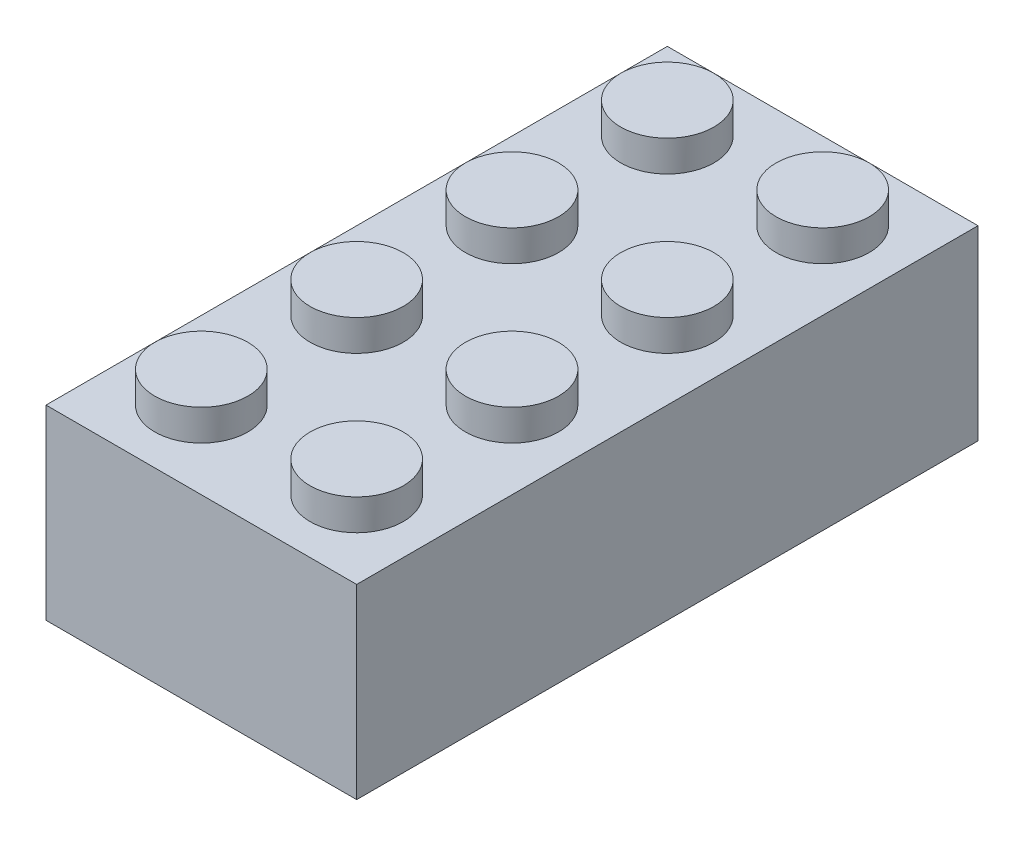
ISO-10303-21;
HEADER;
FILE_DESCRIPTION(('STEP AP214'),'2;1');
FILE_NAME('part.step','',(''),(''),'','','');
FILE_SCHEMA(('AUTOMOTIVE_DESIGN { 1 0 10303 214 1 1 1 1 }'));
ENDSEC;
DATA;
#1=APPLICATION_CONTEXT('core data for automotive mechanical design processes');
#2=APPLICATION_PROTOCOL_DEFINITION('international standard','automotive_design',2000,#1);
#3=PRODUCT_CONTEXT('',#1,'mechanical');
#4=PRODUCT('Part','Part','',(#3));
#5=PRODUCT_RELATED_PRODUCT_CATEGORY('part','',(#4));
#6=PRODUCT_DEFINITION_FORMATION('','',#4);
#7=PRODUCT_DEFINITION_CONTEXT('part definition',#1,'design');
#8=PRODUCT_DEFINITION('design','',#6,#7);
#9=PRODUCT_DEFINITION_SHAPE('','',#8);
#10=(LENGTH_UNIT() NAMED_UNIT(*) SI_UNIT(.MILLI.,.METRE.));
#11=(NAMED_UNIT(*) PLANE_ANGLE_UNIT() SI_UNIT($,.RADIAN.));
#12=(NAMED_UNIT(*) SI_UNIT($,.STERADIAN.) SOLID_ANGLE_UNIT());
#13=UNCERTAINTY_MEASURE_WITH_UNIT(LENGTH_MEASURE(1.E-05),#10,'distance_accuracy_value','');
#14=(GEOMETRIC_REPRESENTATION_CONTEXT(3) GLOBAL_UNCERTAINTY_ASSIGNED_CONTEXT((#13)) GLOBAL_UNIT_ASSIGNED_CONTEXT((#10,
#11,#12)) REPRESENTATION_CONTEXT('',''));
#15=CARTESIAN_POINT('',(0.,0.,0.));
#16=DIRECTION('',(0.,0.,1.));
#17=DIRECTION('',(1.,0.,0.));
#18=AXIS2_PLACEMENT_3D('',#15,#16,#17);
#19=CARTESIAN_POINT('',(0.,0.,0.));
#20=DIRECTION('',(0.,-1.,0.));
#21=DIRECTION('',(0.,0.,-1.));
#22=AXIS2_PLACEMENT_3D('',#19,#20,#21);
#23=PLANE('',#22);
#24=DIRECTION('',(0.,0.,1.));
#25=VECTOR('',#24,1.);
#26=CARTESIAN_POINT('',(0.,0.,0.));
#27=LINE('',#26,#25);
#28=CARTESIAN_POINT('',(0.,0.,-32.));
#29=VERTEX_POINT('',#28);
#30=CARTESIAN_POINT('',(0.,0.,0.));
#31=VERTEX_POINT('',#30);
#32=EDGE_CURVE('E224',#29,#31,#27,.T.);
#33=ORIENTED_EDGE('',*,*,#32,.F.);
#34=DIRECTION('',(-1.,0.,0.));
#35=VECTOR('',#34,1.);
#36=CARTESIAN_POINT('',(0.,0.,-32.));
#37=LINE('',#36,#35);
#38=CARTESIAN_POINT('',(16.,0.,-32.));
#39=VERTEX_POINT('',#38);
#40=EDGE_CURVE('E85',#39,#29,#37,.T.);
#41=ORIENTED_EDGE('',*,*,#40,.F.);
#42=DIRECTION('',(0.,0.,-1.));
#43=VECTOR('',#42,1.);
#44=CARTESIAN_POINT('',(16.,0.,0.));
#45=LINE('',#44,#43);
#46=CARTESIAN_POINT('',(16.,0.,0.));
#47=VERTEX_POINT('',#46);
#48=EDGE_CURVE('E242',#47,#39,#45,.T.);
#49=ORIENTED_EDGE('',*,*,#48,.F.);
#50=DIRECTION('',(1.,0.,0.));
#51=VECTOR('',#50,1.);
#52=CARTESIAN_POINT('',(0.,0.,0.));
#53=LINE('',#52,#51);
#54=EDGE_CURVE('E239',#31,#47,#53,.T.);
#55=ORIENTED_EDGE('',*,*,#54,.F.);
#56=EDGE_LOOP('',(#33,#41,#49,#55));
#57=FACE_BOUND('',#56,.T.);
#58=DIRECTION('',(-1.,0.,0.));
#59=VECTOR('',#58,1.);
#60=CARTESIAN_POINT('',(0.,0.,-30.4));
#61=LINE('',#60,#59);
#62=CARTESIAN_POINT('',(14.4,0.,-30.4));
#63=VERTEX_POINT('',#62);
#64=CARTESIAN_POINT('',(1.6,0.,-30.4));
#65=VERTEX_POINT('',#64);
#66=EDGE_CURVE('E207',#63,#65,#61,.T.);
#67=ORIENTED_EDGE('',*,*,#66,.T.);
#68=DIRECTION('',(0.,0.,1.));
#69=VECTOR('',#68,1.);
#70=CARTESIAN_POINT('',(1.6,0.,0.));
#71=LINE('',#70,#69);
#72=CARTESIAN_POINT('',(1.6,0.,-1.6));
#73=VERTEX_POINT('',#72);
#74=EDGE_CURVE('E198',#65,#73,#71,.T.);
#75=ORIENTED_EDGE('',*,*,#74,.T.);
#76=DIRECTION('',(1.,0.,0.));
#77=VECTOR('',#76,1.);
#78=CARTESIAN_POINT('',(0.,0.,-1.6));
#79=LINE('',#78,#77);
#80=CARTESIAN_POINT('',(14.4,0.,-1.6));
#81=VERTEX_POINT('',#80);
#82=EDGE_CURVE('E206',#73,#81,#79,.T.);
#83=ORIENTED_EDGE('',*,*,#82,.T.);
#84=DIRECTION('',(0.,0.,-1.));
#85=VECTOR('',#84,1.);
#86=CARTESIAN_POINT('',(14.4,0.,0.));
#87=LINE('',#86,#85);
#88=EDGE_CURVE('E55',#81,#63,#87,.T.);
#89=ORIENTED_EDGE('',*,*,#88,.T.);
#90=EDGE_LOOP('',(#67,#75,#83,#89));
#91=FACE_BOUND('',#90,.T.);
#92=ADVANCED_FACE('F39',(#57,#91),#23,.T.);
#93=CARTESIAN_POINT('',(4.,11.2,-28.));
#94=DIRECTION('',(0.,1.,0.));
#95=DIRECTION('',(0.,0.,1.));
#96=AXIS2_PLACEMENT_3D('',#93,#94,#95);
#97=PLANE('',#96);
#98=CARTESIAN_POINT('',(4.,11.2,-28.));
#99=DIRECTION('',(0.,1.,0.));
#100=DIRECTION('',(0.,0.,1.));
#101=AXIS2_PLACEMENT_3D('',#98,#99,#100);
#102=CIRCLE('',#101,2.4);
#103=CARTESIAN_POINT('',(4.,11.2,-25.6));
#104=VERTEX_POINT('',#103);
#105=EDGE_CURVE('E11',#104,#104,#102,.T.);
#106=ORIENTED_EDGE('',*,*,#105,.T.);
#107=EDGE_LOOP('',(#106));
#108=FACE_BOUND('',#107,.T.);
#109=ADVANCED_FACE('F41',(#108),#97,.T.);
#110=CARTESIAN_POINT('',(4.,11.2,-28.));
#111=DIRECTION('',(0.,-1.,0.));
#112=DIRECTION('',(0.,0.,-1.));
#113=AXIS2_PLACEMENT_3D('',#110,#111,#112);
#114=CYLINDRICAL_SURFACE('',#113,2.4);
#115=ORIENTED_EDGE('',*,*,#105,.F.);
#116=EDGE_LOOP('',(#115));
#117=FACE_BOUND('',#116,.T.);
#118=CARTESIAN_POINT('',(4.,9.6,-28.));
#119=DIRECTION('',(0.,-1.,0.));
#120=DIRECTION('',(0.,0.,-1.));
#121=AXIS2_PLACEMENT_3D('',#118,#119,#120);
#122=CIRCLE('',#121,2.4);
#123=CARTESIAN_POINT('',(4.,9.6,-30.4));
#124=VERTEX_POINT('',#123);
#125=EDGE_CURVE('E48',#124,#124,#122,.F.);
#126=ORIENTED_EDGE('',*,*,#125,.T.);
#127=EDGE_LOOP('',(#126));
#128=FACE_BOUND('',#127,.T.);
#129=ADVANCED_FACE('F310',(#117,#128),#114,.T.);
#130=CARTESIAN_POINT('',(12.,11.2,-28.));
#131=DIRECTION('',(0.,1.,0.));
#132=DIRECTION('',(0.,0.,1.));
#133=AXIS2_PLACEMENT_3D('',#130,#131,#132);
#134=PLANE('',#133);
#135=CARTESIAN_POINT('',(12.,11.2,-28.));
#136=DIRECTION('',(0.,1.,0.));
#137=DIRECTION('',(0.,0.,1.));
#138=AXIS2_PLACEMENT_3D('',#135,#136,#137);
#139=CIRCLE('',#138,2.4);
#140=CARTESIAN_POINT('',(12.,11.2,-25.6));
#141=VERTEX_POINT('',#140);
#142=EDGE_CURVE('E303',#141,#141,#139,.T.);
#143=ORIENTED_EDGE('',*,*,#142,.T.);
#144=EDGE_LOOP('',(#143));
#145=FACE_BOUND('',#144,.T.);
#146=ADVANCED_FACE('F384',(#145),#134,.T.);
#147=CARTESIAN_POINT('',(12.,11.2,-28.));
#148=DIRECTION('',(0.,-1.,0.));
#149=DIRECTION('',(0.,0.,-1.));
#150=AXIS2_PLACEMENT_3D('',#147,#148,#149);
#151=CYLINDRICAL_SURFACE('',#150,2.4);
#152=ORIENTED_EDGE('',*,*,#142,.F.);
#153=EDGE_LOOP('',(#152));
#154=FACE_BOUND('',#153,.T.);
#155=CARTESIAN_POINT('',(12.,9.6,-28.));
#156=DIRECTION('',(0.,-1.,0.));
#157=DIRECTION('',(0.,0.,-1.));
#158=AXIS2_PLACEMENT_3D('',#155,#156,#157);
#159=CIRCLE('',#158,2.4);
#160=CARTESIAN_POINT('',(12.,9.6,-30.4));
#161=VERTEX_POINT('',#160);
#162=EDGE_CURVE('E299',#161,#161,#159,.F.);
#163=ORIENTED_EDGE('',*,*,#162,.T.);
#164=EDGE_LOOP('',(#163));
#165=FACE_BOUND('',#164,.T.);
#166=ADVANCED_FACE('F380',(#154,#165),#151,.T.);
#167=CARTESIAN_POINT('',(4.,11.2,-20.));
#168=DIRECTION('',(0.,1.,0.));
#169=DIRECTION('',(0.,0.,1.));
#170=AXIS2_PLACEMENT_3D('',#167,#168,#169);
#171=PLANE('',#170);
#172=CARTESIAN_POINT('',(4.,11.2,-20.));
#173=DIRECTION('',(0.,1.,0.));
#174=DIRECTION('',(0.,0.,1.));
#175=AXIS2_PLACEMENT_3D('',#172,#173,#174);
#176=CIRCLE('',#175,2.4);
#177=CARTESIAN_POINT('',(4.,11.2,-17.6));
#178=VERTEX_POINT('',#177);
#179=EDGE_CURVE('E295',#178,#178,#176,.T.);
#180=ORIENTED_EDGE('',*,*,#179,.T.);
#181=EDGE_LOOP('',(#180));
#182=FACE_BOUND('',#181,.T.);
#183=ADVANCED_FACE('F376',(#182),#171,.T.);
#184=CARTESIAN_POINT('',(4.,11.2,-20.));
#185=DIRECTION('',(0.,-1.,0.));
#186=DIRECTION('',(0.,0.,-1.));
#187=AXIS2_PLACEMENT_3D('',#184,#185,#186);
#188=CYLINDRICAL_SURFACE('',#187,2.4);
#189=ORIENTED_EDGE('',*,*,#179,.F.);
#190=EDGE_LOOP('',(#189));
#191=FACE_BOUND('',#190,.T.);
#192=CARTESIAN_POINT('',(4.,9.6,-20.));
#193=DIRECTION('',(0.,-1.,0.));
#194=DIRECTION('',(0.,0.,-1.));
#195=AXIS2_PLACEMENT_3D('',#192,#193,#194);
#196=CIRCLE('',#195,2.4);
#197=CARTESIAN_POINT('',(4.,9.6,-22.4));
#198=VERTEX_POINT('',#197);
#199=EDGE_CURVE('E291',#198,#198,#196,.F.);
#200=ORIENTED_EDGE('',*,*,#199,.T.);
#201=EDGE_LOOP('',(#200));
#202=FACE_BOUND('',#201,.T.);
#203=ADVANCED_FACE('F372',(#191,#202),#188,.T.);
#204=CARTESIAN_POINT('',(12.,11.2,-20.));
#205=DIRECTION('',(0.,1.,0.));
#206=DIRECTION('',(0.,0.,1.));
#207=AXIS2_PLACEMENT_3D('',#204,#205,#206);
#208=PLANE('',#207);
#209=CARTESIAN_POINT('',(12.,11.2,-20.));
#210=DIRECTION('',(0.,1.,0.));
#211=DIRECTION('',(0.,0.,1.));
#212=AXIS2_PLACEMENT_3D('',#209,#210,#211);
#213=CIRCLE('',#212,2.4);
#214=CARTESIAN_POINT('',(12.,11.2,-17.6));
#215=VERTEX_POINT('',#214);
#216=EDGE_CURVE('E287',#215,#215,#213,.T.);
#217=ORIENTED_EDGE('',*,*,#216,.T.);
#218=EDGE_LOOP('',(#217));
#219=FACE_BOUND('',#218,.T.);
#220=ADVANCED_FACE('F368',(#219),#208,.T.);
#221=CARTESIAN_POINT('',(12.,11.2,-20.));
#222=DIRECTION('',(0.,-1.,0.));
#223=DIRECTION('',(0.,0.,-1.));
#224=AXIS2_PLACEMENT_3D('',#221,#222,#223);
#225=CYLINDRICAL_SURFACE('',#224,2.4);
#226=ORIENTED_EDGE('',*,*,#216,.F.);
#227=EDGE_LOOP('',(#226));
#228=FACE_BOUND('',#227,.T.);
#229=CARTESIAN_POINT('',(12.,9.6,-20.));
#230=DIRECTION('',(0.,-1.,0.));
#231=DIRECTION('',(0.,0.,-1.));
#232=AXIS2_PLACEMENT_3D('',#229,#230,#231);
#233=CIRCLE('',#232,2.4);
#234=CARTESIAN_POINT('',(12.,9.6,-22.4));
#235=VERTEX_POINT('',#234);
#236=EDGE_CURVE('E283',#235,#235,#233,.F.);
#237=ORIENTED_EDGE('',*,*,#236,.T.);
#238=EDGE_LOOP('',(#237));
#239=FACE_BOUND('',#238,.T.);
#240=ADVANCED_FACE('F364',(#228,#239),#225,.T.);
#241=CARTESIAN_POINT('',(4.,11.2,-12.));
#242=DIRECTION('',(0.,1.,0.));
#243=DIRECTION('',(0.,0.,1.));
#244=AXIS2_PLACEMENT_3D('',#241,#242,#243);
#245=PLANE('',#244);
#246=CARTESIAN_POINT('',(4.,11.2,-12.));
#247=DIRECTION('',(0.,1.,0.));
#248=DIRECTION('',(0.,0.,1.));
#249=AXIS2_PLACEMENT_3D('',#246,#247,#248);
#250=CIRCLE('',#249,2.4);
#251=CARTESIAN_POINT('',(4.,11.2,-9.6));
#252=VERTEX_POINT('',#251);
#253=EDGE_CURVE('E279',#252,#252,#250,.T.);
#254=ORIENTED_EDGE('',*,*,#253,.T.);
#255=EDGE_LOOP('',(#254));
#256=FACE_BOUND('',#255,.T.);
#257=ADVANCED_FACE('F360',(#256),#245,.T.);
#258=CARTESIAN_POINT('',(4.,11.2,-12.));
#259=DIRECTION('',(0.,-1.,0.));
#260=DIRECTION('',(0.,0.,-1.));
#261=AXIS2_PLACEMENT_3D('',#258,#259,#260);
#262=CYLINDRICAL_SURFACE('',#261,2.4);
#263=ORIENTED_EDGE('',*,*,#253,.F.);
#264=EDGE_LOOP('',(#263));
#265=FACE_BOUND('',#264,.T.);
#266=CARTESIAN_POINT('',(4.,9.6,-12.));
#267=DIRECTION('',(0.,-1.,0.));
#268=DIRECTION('',(0.,0.,-1.));
#269=AXIS2_PLACEMENT_3D('',#266,#267,#268);
#270=CIRCLE('',#269,2.4);
#271=CARTESIAN_POINT('',(4.,9.6,-14.4));
#272=VERTEX_POINT('',#271);
#273=EDGE_CURVE('E275',#272,#272,#270,.F.);
#274=ORIENTED_EDGE('',*,*,#273,.T.);
#275=EDGE_LOOP('',(#274));
#276=FACE_BOUND('',#275,.T.);
#277=ADVANCED_FACE('F356',(#265,#276),#262,.T.);
#278=CARTESIAN_POINT('',(12.,11.2,-12.));
#279=DIRECTION('',(0.,1.,0.));
#280=DIRECTION('',(0.,0.,1.));
#281=AXIS2_PLACEMENT_3D('',#278,#279,#280);
#282=PLANE('',#281);
#283=CARTESIAN_POINT('',(12.,11.2,-12.));
#284=DIRECTION('',(0.,1.,0.));
#285=DIRECTION('',(0.,0.,1.));
#286=AXIS2_PLACEMENT_3D('',#283,#284,#285);
#287=CIRCLE('',#286,2.4);
#288=CARTESIAN_POINT('',(12.,11.2,-9.6));
#289=VERTEX_POINT('',#288);
#290=EDGE_CURVE('E271',#289,#289,#287,.T.);
#291=ORIENTED_EDGE('',*,*,#290,.T.);
#292=EDGE_LOOP('',(#291));
#293=FACE_BOUND('',#292,.T.);
#294=ADVANCED_FACE('F352',(#293),#282,.T.);
#295=CARTESIAN_POINT('',(12.,11.2,-12.));
#296=DIRECTION('',(0.,-1.,0.));
#297=DIRECTION('',(0.,0.,-1.));
#298=AXIS2_PLACEMENT_3D('',#295,#296,#297);
#299=CYLINDRICAL_SURFACE('',#298,2.4);
#300=ORIENTED_EDGE('',*,*,#290,.F.);
#301=EDGE_LOOP('',(#300));
#302=FACE_BOUND('',#301,.T.);
#303=CARTESIAN_POINT('',(12.,9.6,-12.));
#304=DIRECTION('',(0.,-1.,0.));
#305=DIRECTION('',(0.,0.,-1.));
#306=AXIS2_PLACEMENT_3D('',#303,#304,#305);
#307=CIRCLE('',#306,2.4);
#308=CARTESIAN_POINT('',(12.,9.6,-14.4));
#309=VERTEX_POINT('',#308);
#310=EDGE_CURVE('E267',#309,#309,#307,.F.);
#311=ORIENTED_EDGE('',*,*,#310,.T.);
#312=EDGE_LOOP('',(#311));
#313=FACE_BOUND('',#312,.T.);
#314=ADVANCED_FACE('F348',(#302,#313),#299,.T.);
#315=CARTESIAN_POINT('',(0.,9.6,0.));
#316=DIRECTION('',(1.,0.,0.));
#317=DIRECTION('',(0.,0.,-1.));
#318=AXIS2_PLACEMENT_3D('',#315,#316,#317);
#319=PLANE('',#318);
#320=ORIENTED_EDGE('',*,*,#32,.T.);
#321=DIRECTION('',(0.,-1.,0.));
#322=VECTOR('',#321,1.);
#323=CARTESIAN_POINT('',(0.,9.6,0.));
#324=LINE('',#323,#322);
#325=CARTESIAN_POINT('',(0.,9.6,0.));
#326=VERTEX_POINT('',#325);
#327=EDGE_CURVE('E256',#326,#31,#324,.T.);
#328=ORIENTED_EDGE('',*,*,#327,.F.);
#329=DIRECTION('',(0.,0.,1.));
#330=VECTOR('',#329,1.);
#331=CARTESIAN_POINT('',(0.,9.6,0.));
#332=LINE('',#331,#330);
#333=CARTESIAN_POINT('',(0.,9.6,-32.));
#334=VERTEX_POINT('',#333);
#335=EDGE_CURVE('E225',#334,#326,#332,.T.);
#336=ORIENTED_EDGE('',*,*,#335,.F.);
#337=DIRECTION('',(0.,-1.,0.));
#338=VECTOR('',#337,1.);
#339=CARTESIAN_POINT('',(0.,9.6,-32.));
#340=LINE('',#339,#338);
#341=EDGE_CURVE('E235',#334,#29,#340,.T.);
#342=ORIENTED_EDGE('',*,*,#341,.T.);
#343=EDGE_LOOP('',(#320,#328,#336,#342));
#344=FACE_BOUND('',#343,.T.);
#345=ADVANCED_FACE('F345',(#344),#319,.F.);
#346=CARTESIAN_POINT('',(0.,9.6,0.));
#347=DIRECTION('',(0.,0.,-1.));
#348=DIRECTION('',(-1.,0.,0.));
#349=AXIS2_PLACEMENT_3D('',#346,#347,#348);
#350=PLANE('',#349);
#351=ORIENTED_EDGE('',*,*,#54,.T.);
#352=DIRECTION('',(0.,-1.,0.));
#353=VECTOR('',#352,1.);
#354=CARTESIAN_POINT('',(16.,9.6,0.));
#355=LINE('',#354,#353);
#356=CARTESIAN_POINT('',(16.,9.6,0.));
#357=VERTEX_POINT('',#356);
#358=EDGE_CURVE('E252',#357,#47,#355,.T.);
#359=ORIENTED_EDGE('',*,*,#358,.F.);
#360=DIRECTION('',(1.,0.,0.));
#361=VECTOR('',#360,1.);
#362=CARTESIAN_POINT('',(0.,9.6,0.));
#363=LINE('',#362,#361);
#364=EDGE_CURVE('E93',#326,#357,#363,.T.);
#365=ORIENTED_EDGE('',*,*,#364,.F.);
#366=ORIENTED_EDGE('',*,*,#327,.T.);
#367=EDGE_LOOP('',(#351,#359,#365,#366));
#368=FACE_BOUND('',#367,.T.);
#369=ADVANCED_FACE('F341',(#368),#350,.F.);
#370=CARTESIAN_POINT('',(16.,9.6,0.));
#371=DIRECTION('',(-1.,0.,0.));
#372=DIRECTION('',(0.,0.,1.));
#373=AXIS2_PLACEMENT_3D('',#370,#371,#372);
#374=PLANE('',#373);
#375=ORIENTED_EDGE('',*,*,#48,.T.);
#376=DIRECTION('',(0.,-1.,0.));
#377=VECTOR('',#376,1.);
#378=CARTESIAN_POINT('',(16.,9.6,-32.));
#379=LINE('',#378,#377);
#380=CARTESIAN_POINT('',(16.,9.6,-32.));
#381=VERTEX_POINT('',#380);
#382=EDGE_CURVE('E249',#381,#39,#379,.T.);
#383=ORIENTED_EDGE('',*,*,#382,.F.);
#384=DIRECTION('',(0.,0.,-1.));
#385=VECTOR('',#384,1.);
#386=CARTESIAN_POINT('',(16.,9.6,0.));
#387=LINE('',#386,#385);
#388=EDGE_CURVE('E230',#357,#381,#387,.T.);
#389=ORIENTED_EDGE('',*,*,#388,.F.);
#390=ORIENTED_EDGE('',*,*,#358,.T.);
#391=EDGE_LOOP('',(#375,#383,#389,#390));
#392=FACE_BOUND('',#391,.T.);
#393=ADVANCED_FACE('F325',(#392),#374,.F.);
#394=CARTESIAN_POINT('',(0.,9.6,-32.));
#395=DIRECTION('',(0.,0.,1.));
#396=DIRECTION('',(1.,0.,0.));
#397=AXIS2_PLACEMENT_3D('',#394,#395,#396);
#398=PLANE('',#397);
#399=ORIENTED_EDGE('',*,*,#40,.T.);
#400=ORIENTED_EDGE('',*,*,#341,.F.);
#401=DIRECTION('',(-1.,0.,0.));
#402=VECTOR('',#401,1.);
#403=CARTESIAN_POINT('',(0.,9.6,-32.));
#404=LINE('',#403,#402);
#405=EDGE_CURVE('E64',#381,#334,#404,.T.);
#406=ORIENTED_EDGE('',*,*,#405,.F.);
#407=ORIENTED_EDGE('',*,*,#382,.T.);
#408=EDGE_LOOP('',(#399,#400,#406,#407));
#409=FACE_BOUND('',#408,.T.);
#410=ADVANCED_FACE('F315',(#409),#398,.F.);
#411=CARTESIAN_POINT('',(0.,9.6,0.));
#412=DIRECTION('',(0.,-1.,0.));
#413=DIRECTION('',(0.,0.,-1.));
#414=AXIS2_PLACEMENT_3D('',#411,#412,#413);
#415=PLANE('',#414);
#416=CARTESIAN_POINT('',(4.,9.6,-4.));
#417=DIRECTION('',(0.,-1.,0.));
#418=DIRECTION('',(0.,0.,-1.));
#419=AXIS2_PLACEMENT_3D('',#416,#417,#418);
#420=CIRCLE('',#419,2.4);
#421=CARTESIAN_POINT('',(4.,9.6,-6.4));
#422=VERTEX_POINT('',#421);
#423=EDGE_CURVE('E263',#422,#422,#420,.F.);
#424=ORIENTED_EDGE('',*,*,#423,.F.);
#425=EDGE_LOOP('',(#424));
#426=FACE_BOUND('',#425,.T.);
#427=CARTESIAN_POINT('',(12.,9.6,-4.));
#428=DIRECTION('',(0.,-1.,0.));
#429=DIRECTION('',(0.,0.,-1.));
#430=AXIS2_PLACEMENT_3D('',#427,#428,#429);
#431=CIRCLE('',#430,2.4);
#432=CARTESIAN_POINT('',(12.,9.6,-6.4));
#433=VERTEX_POINT('',#432);
#434=EDGE_CURVE('E259',#433,#433,#431,.F.);
#435=ORIENTED_EDGE('',*,*,#434,.F.);
#436=EDGE_LOOP('',(#435));
#437=FACE_BOUND('',#436,.T.);
#438=ORIENTED_EDGE('',*,*,#335,.T.);
#439=ORIENTED_EDGE('',*,*,#364,.T.);
#440=ORIENTED_EDGE('',*,*,#388,.T.);
#441=ORIENTED_EDGE('',*,*,#405,.T.);
#442=EDGE_LOOP('',(#438,#439,#440,#441));
#443=FACE_BOUND('',#442,.T.);
#444=ORIENTED_EDGE('',*,*,#310,.F.);
#445=EDGE_LOOP('',(#444));
#446=FACE_BOUND('',#445,.T.);
#447=ORIENTED_EDGE('',*,*,#273,.F.);
#448=EDGE_LOOP('',(#447));
#449=FACE_BOUND('',#448,.T.);
#450=ORIENTED_EDGE('',*,*,#236,.F.);
#451=EDGE_LOOP('',(#450));
#452=FACE_BOUND('',#451,.T.);
#453=ORIENTED_EDGE('',*,*,#199,.F.);
#454=EDGE_LOOP('',(#453));
#455=FACE_BOUND('',#454,.T.);
#456=ORIENTED_EDGE('',*,*,#162,.F.);
#457=EDGE_LOOP('',(#456));
#458=FACE_BOUND('',#457,.T.);
#459=ORIENTED_EDGE('',*,*,#125,.F.);
#460=EDGE_LOOP('',(#459));
#461=FACE_BOUND('',#460,.T.);
#462=ADVANCED_FACE('F312',(#426,#437,#443,#446,#449,#452,#455,#458,#461),#415,.F.);
#463=CARTESIAN_POINT('',(12.,11.2,-4.));
#464=DIRECTION('',(0.,-1.,0.));
#465=DIRECTION('',(0.,0.,-1.));
#466=AXIS2_PLACEMENT_3D('',#463,#464,#465);
#467=CYLINDRICAL_SURFACE('',#466,2.4);
#468=CARTESIAN_POINT('',(12.,11.2,-4.));
#469=DIRECTION('',(0.,1.,0.));
#470=DIRECTION('',(0.,0.,1.));
#471=AXIS2_PLACEMENT_3D('',#468,#469,#470);
#472=CIRCLE('',#471,2.4);
#473=CARTESIAN_POINT('',(12.,11.2,-1.6));
#474=VERTEX_POINT('',#473);
#475=EDGE_CURVE('E219',#474,#474,#472,.T.);
#476=ORIENTED_EDGE('',*,*,#475,.F.);
#477=EDGE_LOOP('',(#476));
#478=FACE_BOUND('',#477,.T.);
#479=ORIENTED_EDGE('',*,*,#434,.T.);
#480=EDGE_LOOP('',(#479));
#481=FACE_BOUND('',#480,.T.);
#482=ADVANCED_FACE('F314',(#478,#481),#467,.T.);
#483=CARTESIAN_POINT('',(12.,11.2,-4.));
#484=DIRECTION('',(0.,1.,0.));
#485=DIRECTION('',(0.,0.,1.));
#486=AXIS2_PLACEMENT_3D('',#483,#484,#485);
#487=PLANE('',#486);
#488=ORIENTED_EDGE('',*,*,#475,.T.);
#489=EDGE_LOOP('',(#488));
#490=FACE_BOUND('',#489,.T.);
#491=ADVANCED_FACE('F322',(#490),#487,.T.);
#492=CARTESIAN_POINT('',(4.,11.2,-4.));
#493=DIRECTION('',(0.,-1.,0.));
#494=DIRECTION('',(0.,0.,-1.));
#495=AXIS2_PLACEMENT_3D('',#492,#493,#494);
#496=CYLINDRICAL_SURFACE('',#495,2.4);
#497=CARTESIAN_POINT('',(4.,11.2,-4.));
#498=DIRECTION('',(0.,1.,0.));
#499=DIRECTION('',(0.,0.,1.));
#500=AXIS2_PLACEMENT_3D('',#497,#498,#499);
#501=CIRCLE('',#500,2.4);
#502=CARTESIAN_POINT('',(4.,11.2,-1.6));
#503=VERTEX_POINT('',#502);
#504=EDGE_CURVE('E215',#503,#503,#501,.T.);
#505=ORIENTED_EDGE('',*,*,#504,.F.);
#506=EDGE_LOOP('',(#505));
#507=FACE_BOUND('',#506,.T.);
#508=ORIENTED_EDGE('',*,*,#423,.T.);
#509=EDGE_LOOP('',(#508));
#510=FACE_BOUND('',#509,.T.);
#511=ADVANCED_FACE('F466',(#507,#510),#496,.T.);
#512=CARTESIAN_POINT('',(4.,11.2,-4.));
#513=DIRECTION('',(0.,1.,0.));
#514=DIRECTION('',(0.,0.,1.));
#515=AXIS2_PLACEMENT_3D('',#512,#513,#514);
#516=PLANE('',#515);
#517=ORIENTED_EDGE('',*,*,#504,.T.);
#518=EDGE_LOOP('',(#517));
#519=FACE_BOUND('',#518,.T.);
#520=ADVANCED_FACE('F504',(#519),#516,.T.);
#521=CARTESIAN_POINT('',(4.,9.6,-28.));
#522=DIRECTION('',(0.,1.,0.));
#523=DIRECTION('',(0.,0.,1.));
#524=AXIS2_PLACEMENT_3D('',#521,#522,#523);
#525=PLANE('',#524);
#526=CARTESIAN_POINT('',(4.,9.6,-28.));
#527=DIRECTION('',(0.,1.,0.));
#528=DIRECTION('',(0.,0.,1.));
#529=AXIS2_PLACEMENT_3D('',#526,#527,#528);
#530=CIRCLE('',#529,0.799999999999999);
#531=CARTESIAN_POINT('',(4.,9.6,-27.2));
#532=VERTEX_POINT('',#531);
#533=EDGE_CURVE('E220',#532,#532,#530,.T.);
#534=ORIENTED_EDGE('',*,*,#533,.F.);
#535=EDGE_LOOP('',(#534));
#536=FACE_BOUND('',#535,.T.);
#537=ADVANCED_FACE('F513',(#536),#525,.F.);
#538=CARTESIAN_POINT('',(4.,11.2,-28.));
#539=DIRECTION('',(0.,-1.,0.));
#540=DIRECTION('',(0.,0.,-1.));
#541=AXIS2_PLACEMENT_3D('',#538,#539,#540);
#542=CYLINDRICAL_SURFACE('',#541,0.799999999999999);
#543=ORIENTED_EDGE('',*,*,#533,.T.);
#544=EDGE_LOOP('',(#543));
#545=FACE_BOUND('',#544,.T.);
#546=CARTESIAN_POINT('',(4.,8.,-28.));
#547=DIRECTION('',(0.,-1.,0.));
#548=DIRECTION('',(0.,0.,-1.));
#549=AXIS2_PLACEMENT_3D('',#546,#547,#548);
#550=CIRCLE('',#549,0.799999999999999);
#551=CARTESIAN_POINT('',(4.,8.,-28.8));
#552=VERTEX_POINT('',#551);
#553=EDGE_CURVE('E174',#552,#552,#550,.F.);
#554=ORIENTED_EDGE('',*,*,#553,.F.);
#555=EDGE_LOOP('',(#554));
#556=FACE_BOUND('',#555,.T.);
#557=ADVANCED_FACE('F526',(#545,#556),#542,.F.);
#558=CARTESIAN_POINT('',(12.,9.6,-28.));
#559=DIRECTION('',(0.,1.,0.));
#560=DIRECTION('',(0.,0.,1.));
#561=AXIS2_PLACEMENT_3D('',#558,#559,#560);
#562=PLANE('',#561);
#563=CARTESIAN_POINT('',(12.,9.6,-28.));
#564=DIRECTION('',(0.,1.,0.));
#565=DIRECTION('',(0.,0.,1.));
#566=AXIS2_PLACEMENT_3D('',#563,#564,#565);
#567=CIRCLE('',#566,0.799999999999999);
#568=CARTESIAN_POINT('',(12.,9.6,-27.2));
#569=VERTEX_POINT('',#568);
#570=EDGE_CURVE('E170',#569,#569,#567,.T.);
#571=ORIENTED_EDGE('',*,*,#570,.F.);
#572=EDGE_LOOP('',(#571));
#573=FACE_BOUND('',#572,.T.);
#574=ADVANCED_FACE('F535',(#573),#562,.F.);
#575=CARTESIAN_POINT('',(12.,11.2,-28.));
#576=DIRECTION('',(0.,-1.,0.));
#577=DIRECTION('',(0.,0.,-1.));
#578=AXIS2_PLACEMENT_3D('',#575,#576,#577);
#579=CYLINDRICAL_SURFACE('',#578,0.799999999999999);
#580=ORIENTED_EDGE('',*,*,#570,.T.);
#581=EDGE_LOOP('',(#580));
#582=FACE_BOUND('',#581,.T.);
#583=CARTESIAN_POINT('',(12.,8.,-28.));
#584=DIRECTION('',(0.,-1.,0.));
#585=DIRECTION('',(0.,0.,-1.));
#586=AXIS2_PLACEMENT_3D('',#583,#584,#585);
#587=CIRCLE('',#586,0.799999999999999);
#588=CARTESIAN_POINT('',(12.,8.,-28.8));
#589=VERTEX_POINT('',#588);
#590=EDGE_CURVE('E166',#589,#589,#587,.F.);
#591=ORIENTED_EDGE('',*,*,#590,.F.);
#592=EDGE_LOOP('',(#591));
#593=FACE_BOUND('',#592,.T.);
#594=ADVANCED_FACE('F544',(#582,#593),#579,.F.);
#595=CARTESIAN_POINT('',(4.,9.6,-20.));
#596=DIRECTION('',(0.,1.,0.));
#597=DIRECTION('',(0.,0.,1.));
#598=AXIS2_PLACEMENT_3D('',#595,#596,#597);
#599=PLANE('',#598);
#600=CARTESIAN_POINT('',(4.,9.6,-20.));
#601=DIRECTION('',(0.,1.,0.));
#602=DIRECTION('',(0.,0.,1.));
#603=AXIS2_PLACEMENT_3D('',#600,#601,#602);
#604=CIRCLE('',#603,0.799999999999999);
#605=CARTESIAN_POINT('',(4.,9.6,-19.2));
#606=VERTEX_POINT('',#605);
#607=EDGE_CURVE('E165',#606,#606,#604,.T.);
#608=ORIENTED_EDGE('',*,*,#607,.F.);
#609=EDGE_LOOP('',(#608));
#610=FACE_BOUND('',#609,.T.);
#611=ADVANCED_FACE('F553',(#610),#599,.F.);
#612=CARTESIAN_POINT('',(4.,11.2,-20.));
#613=DIRECTION('',(0.,-1.,0.));
#614=DIRECTION('',(0.,0.,-1.));
#615=AXIS2_PLACEMENT_3D('',#612,#613,#614);
#616=CYLINDRICAL_SURFACE('',#615,0.799999999999999);
#617=ORIENTED_EDGE('',*,*,#607,.T.);
#618=EDGE_LOOP('',(#617));
#619=FACE_BOUND('',#618,.T.);
#620=CARTESIAN_POINT('',(4.,8.,-20.));
#621=DIRECTION('',(0.,-1.,0.));
#622=DIRECTION('',(0.,0.,-1.));
#623=AXIS2_PLACEMENT_3D('',#620,#621,#622);
#624=CIRCLE('',#623,0.799999999999999);
#625=CARTESIAN_POINT('',(4.,8.,-20.8));
#626=VERTEX_POINT('',#625);
#627=EDGE_CURVE('E161',#626,#626,#624,.F.);
#628=ORIENTED_EDGE('',*,*,#627,.F.);
#629=EDGE_LOOP('',(#628));
#630=FACE_BOUND('',#629,.T.);
#631=ADVANCED_FACE('F562',(#619,#630),#616,.F.);
#632=CARTESIAN_POINT('',(12.,9.6,-20.));
#633=DIRECTION('',(0.,1.,0.));
#634=DIRECTION('',(0.,0.,1.));
#635=AXIS2_PLACEMENT_3D('',#632,#633,#634);
#636=PLANE('',#635);
#637=CARTESIAN_POINT('',(12.,9.6,-20.));
#638=DIRECTION('',(0.,1.,0.));
#639=DIRECTION('',(0.,0.,1.));
#640=AXIS2_PLACEMENT_3D('',#637,#638,#639);
#641=CIRCLE('',#640,0.799999999999999);
#642=CARTESIAN_POINT('',(12.,9.6,-19.2));
#643=VERTEX_POINT('',#642);
#644=EDGE_CURVE('E160',#643,#643,#641,.T.);
#645=ORIENTED_EDGE('',*,*,#644,.F.);
#646=EDGE_LOOP('',(#645));
#647=FACE_BOUND('',#646,.T.);
#648=ADVANCED_FACE('F571',(#647),#636,.F.);
#649=CARTESIAN_POINT('',(12.,11.2,-20.));
#650=DIRECTION('',(0.,-1.,0.));
#651=DIRECTION('',(0.,0.,-1.));
#652=AXIS2_PLACEMENT_3D('',#649,#650,#651);
#653=CYLINDRICAL_SURFACE('',#652,0.799999999999999);
#654=ORIENTED_EDGE('',*,*,#644,.T.);
#655=EDGE_LOOP('',(#654));
#656=FACE_BOUND('',#655,.T.);
#657=CARTESIAN_POINT('',(12.,8.,-20.));
#658=DIRECTION('',(0.,-1.,0.));
#659=DIRECTION('',(0.,0.,-1.));
#660=AXIS2_PLACEMENT_3D('',#657,#658,#659);
#661=CIRCLE('',#660,0.799999999999999);
#662=CARTESIAN_POINT('',(12.,8.,-20.8));
#663=VERTEX_POINT('',#662);
#664=EDGE_CURVE('E156',#663,#663,#661,.F.);
#665=ORIENTED_EDGE('',*,*,#664,.F.);
#666=EDGE_LOOP('',(#665));
#667=FACE_BOUND('',#666,.T.);
#668=ADVANCED_FACE('F580',(#656,#667),#653,.F.);
#669=CARTESIAN_POINT('',(4.,9.6,-12.));
#670=DIRECTION('',(0.,1.,0.));
#671=DIRECTION('',(0.,0.,1.));
#672=AXIS2_PLACEMENT_3D('',#669,#670,#671);
#673=PLANE('',#672);
#674=CARTESIAN_POINT('',(4.,9.6,-12.));
#675=DIRECTION('',(0.,1.,0.));
#676=DIRECTION('',(0.,0.,1.));
#677=AXIS2_PLACEMENT_3D('',#674,#675,#676);
#678=CIRCLE('',#677,0.799999999999999);
#679=CARTESIAN_POINT('',(4.,9.6,-11.2));
#680=VERTEX_POINT('',#679);
#681=EDGE_CURVE('E155',#680,#680,#678,.T.);
#682=ORIENTED_EDGE('',*,*,#681,.F.);
#683=EDGE_LOOP('',(#682));
#684=FACE_BOUND('',#683,.T.);
#685=ADVANCED_FACE('F589',(#684),#673,.F.);
#686=CARTESIAN_POINT('',(4.,11.2,-12.));
#687=DIRECTION('',(0.,-1.,0.));
#688=DIRECTION('',(0.,0.,-1.));
#689=AXIS2_PLACEMENT_3D('',#686,#687,#688);
#690=CYLINDRICAL_SURFACE('',#689,0.799999999999999);
#691=ORIENTED_EDGE('',*,*,#681,.T.);
#692=EDGE_LOOP('',(#691));
#693=FACE_BOUND('',#692,.T.);
#694=CARTESIAN_POINT('',(4.,8.,-12.));
#695=DIRECTION('',(0.,-1.,0.));
#696=DIRECTION('',(0.,0.,-1.));
#697=AXIS2_PLACEMENT_3D('',#694,#695,#696);
#698=CIRCLE('',#697,0.799999999999999);
#699=CARTESIAN_POINT('',(4.,8.,-12.8));
#700=VERTEX_POINT('',#699);
#701=EDGE_CURVE('E151',#700,#700,#698,.F.);
#702=ORIENTED_EDGE('',*,*,#701,.F.);
#703=EDGE_LOOP('',(#702));
#704=FACE_BOUND('',#703,.T.);
#705=ADVANCED_FACE('F598',(#693,#704),#690,.F.);
#706=CARTESIAN_POINT('',(12.,9.6,-12.));
#707=DIRECTION('',(0.,1.,0.));
#708=DIRECTION('',(0.,0.,1.));
#709=AXIS2_PLACEMENT_3D('',#706,#707,#708);
#710=PLANE('',#709);
#711=CARTESIAN_POINT('',(12.,9.6,-12.));
#712=DIRECTION('',(0.,1.,0.));
#713=DIRECTION('',(0.,0.,1.));
#714=AXIS2_PLACEMENT_3D('',#711,#712,#713);
#715=CIRCLE('',#714,0.799999999999999);
#716=CARTESIAN_POINT('',(12.,9.6,-11.2));
#717=VERTEX_POINT('',#716);
#718=EDGE_CURVE('E149',#717,#717,#715,.T.);
#719=ORIENTED_EDGE('',*,*,#718,.F.);
#720=EDGE_LOOP('',(#719));
#721=FACE_BOUND('',#720,.T.);
#722=ADVANCED_FACE('F607',(#721),#710,.F.);
#723=CARTESIAN_POINT('',(12.,11.2,-12.));
#724=DIRECTION('',(0.,-1.,0.));
#725=DIRECTION('',(0.,0.,-1.));
#726=AXIS2_PLACEMENT_3D('',#723,#724,#725);
#727=CYLINDRICAL_SURFACE('',#726,0.799999999999999);
#728=ORIENTED_EDGE('',*,*,#718,.T.);
#729=EDGE_LOOP('',(#728));
#730=FACE_BOUND('',#729,.T.);
#731=CARTESIAN_POINT('',(12.,8.,-12.));
#732=DIRECTION('',(0.,-1.,0.));
#733=DIRECTION('',(0.,0.,-1.));
#734=AXIS2_PLACEMENT_3D('',#731,#732,#733);
#735=CIRCLE('',#734,0.799999999999999);
#736=CARTESIAN_POINT('',(12.,8.,-12.8));
#737=VERTEX_POINT('',#736);
#738=EDGE_CURVE('E145',#737,#737,#735,.F.);
#739=ORIENTED_EDGE('',*,*,#738,.F.);
#740=EDGE_LOOP('',(#739));
#741=FACE_BOUND('',#740,.T.);
#742=ADVANCED_FACE('F616',(#730,#741),#727,.F.);
#743=CARTESIAN_POINT('',(1.6,9.6,0.));
#744=DIRECTION('',(1.,0.,0.));
#745=DIRECTION('',(0.,0.,-1.));
#746=AXIS2_PLACEMENT_3D('',#743,#744,#745);
#747=PLANE('',#746);
#748=ORIENTED_EDGE('',*,*,#74,.F.);
#749=DIRECTION('',(0.,-1.,0.));
#750=VECTOR('',#749,1.);
#751=CARTESIAN_POINT('',(1.6,9.6,-30.4));
#752=LINE('',#751,#750);
#753=CARTESIAN_POINT('',(1.6,8.,-30.4));
#754=VERTEX_POINT('',#753);
#755=EDGE_CURVE('E141',#754,#65,#752,.T.);
#756=ORIENTED_EDGE('',*,*,#755,.F.);
#757=DIRECTION('',(0.,0.,1.));
#758=VECTOR('',#757,1.);
#759=CARTESIAN_POINT('',(1.6,8.,0.));
#760=LINE('',#759,#758);
#761=CARTESIAN_POINT('',(1.6,8.,-1.6));
#762=VERTEX_POINT('',#761);
#763=EDGE_CURVE('E127',#754,#762,#760,.T.);
#764=ORIENTED_EDGE('',*,*,#763,.T.);
#765=DIRECTION('',(0.,-1.,0.));
#766=VECTOR('',#765,1.);
#767=CARTESIAN_POINT('',(1.6,9.6,-1.6));
#768=LINE('',#767,#766);
#769=EDGE_CURVE('E120',#762,#73,#768,.T.);
#770=ORIENTED_EDGE('',*,*,#769,.T.);
#771=EDGE_LOOP('',(#748,#756,#764,#770));
#772=FACE_BOUND('',#771,.T.);
#773=ADVANCED_FACE('F625',(#772),#747,.T.);
#774=CARTESIAN_POINT('',(0.,9.6,-1.6));
#775=DIRECTION('',(0.,0.,-1.));
#776=DIRECTION('',(-1.,0.,0.));
#777=AXIS2_PLACEMENT_3D('',#774,#775,#776);
#778=PLANE('',#777);
#779=ORIENTED_EDGE('',*,*,#82,.F.);
#780=ORIENTED_EDGE('',*,*,#769,.F.);
#781=DIRECTION('',(1.,0.,0.));
#782=VECTOR('',#781,1.);
#783=CARTESIAN_POINT('',(0.,8.,-1.6));
#784=LINE('',#783,#782);
#785=CARTESIAN_POINT('',(14.4,8.,-1.6));
#786=VERTEX_POINT('',#785);
#787=EDGE_CURVE('E115',#762,#786,#784,.T.);
#788=ORIENTED_EDGE('',*,*,#787,.T.);
#789=DIRECTION('',(0.,-1.,0.));
#790=VECTOR('',#789,1.);
#791=CARTESIAN_POINT('',(14.4,9.6,-1.6));
#792=LINE('',#791,#790);
#793=EDGE_CURVE('E117',#786,#81,#792,.T.);
#794=ORIENTED_EDGE('',*,*,#793,.T.);
#795=EDGE_LOOP('',(#779,#780,#788,#794));
#796=FACE_BOUND('',#795,.T.);
#797=ADVANCED_FACE('F116',(#796),#778,.T.);
#798=CARTESIAN_POINT('',(14.4,9.6,0.));
#799=DIRECTION('',(-1.,0.,0.));
#800=DIRECTION('',(0.,0.,1.));
#801=AXIS2_PLACEMENT_3D('',#798,#799,#800);
#802=PLANE('',#801);
#803=ORIENTED_EDGE('',*,*,#88,.F.);
#804=ORIENTED_EDGE('',*,*,#793,.F.);
#805=DIRECTION('',(0.,0.,-1.));
#806=VECTOR('',#805,1.);
#807=CARTESIAN_POINT('',(14.4,8.,0.));
#808=LINE('',#807,#806);
#809=CARTESIAN_POINT('',(14.4,8.,-30.4));
#810=VERTEX_POINT('',#809);
#811=EDGE_CURVE('E126',#786,#810,#808,.T.);
#812=ORIENTED_EDGE('',*,*,#811,.T.);
#813=DIRECTION('',(0.,-1.,0.));
#814=VECTOR('',#813,1.);
#815=CARTESIAN_POINT('',(14.4,9.6,-30.4));
#816=LINE('',#815,#814);
#817=EDGE_CURVE('E132',#810,#63,#816,.T.);
#818=ORIENTED_EDGE('',*,*,#817,.T.);
#819=EDGE_LOOP('',(#803,#804,#812,#818));
#820=FACE_BOUND('',#819,.T.);
#821=ADVANCED_FACE('F129',(#820),#802,.T.);
#822=CARTESIAN_POINT('',(0.,9.6,-30.4));
#823=DIRECTION('',(0.,0.,1.));
#824=DIRECTION('',(1.,0.,0.));
#825=AXIS2_PLACEMENT_3D('',#822,#823,#824);
#826=PLANE('',#825);
#827=ORIENTED_EDGE('',*,*,#66,.F.);
#828=ORIENTED_EDGE('',*,*,#817,.F.);
#829=DIRECTION('',(-1.,0.,0.));
#830=VECTOR('',#829,1.);
#831=CARTESIAN_POINT('',(0.,8.,-30.4));
#832=LINE('',#831,#830);
#833=EDGE_CURVE('E137',#810,#754,#832,.T.);
#834=ORIENTED_EDGE('',*,*,#833,.T.);
#835=ORIENTED_EDGE('',*,*,#755,.T.);
#836=EDGE_LOOP('',(#827,#828,#834,#835));
#837=FACE_BOUND('',#836,.T.);
#838=ADVANCED_FACE('F649',(#837),#826,.T.);
#839=CARTESIAN_POINT('',(0.,8.,0.));
#840=DIRECTION('',(0.,-1.,0.));
#841=DIRECTION('',(0.,0.,-1.));
#842=AXIS2_PLACEMENT_3D('',#839,#840,#841);
#843=PLANE('',#842);
#844=CARTESIAN_POINT('',(4.,8.,-4.));
#845=DIRECTION('',(0.,-1.,0.));
#846=DIRECTION('',(0.,0.,-1.));
#847=AXIS2_PLACEMENT_3D('',#844,#845,#846);
#848=CIRCLE('',#847,0.799999999999999);
#849=CARTESIAN_POINT('',(4.,8.,-4.8));
#850=VERTEX_POINT('',#849);
#851=EDGE_CURVE('E150',#850,#850,#848,.F.);
#852=ORIENTED_EDGE('',*,*,#851,.T.);
#853=EDGE_LOOP('',(#852));
#854=FACE_BOUND('',#853,.T.);
#855=CARTESIAN_POINT('',(12.,8.,-4.));
#856=DIRECTION('',(0.,-1.,0.));
#857=DIRECTION('',(0.,0.,-1.));
#858=AXIS2_PLACEMENT_3D('',#855,#856,#857);
#859=CIRCLE('',#858,0.799999999999999);
#860=CARTESIAN_POINT('',(12.,8.,-4.8));
#861=VERTEX_POINT('',#860);
#862=EDGE_CURVE('E189',#861,#861,#859,.F.);
#863=ORIENTED_EDGE('',*,*,#862,.T.);
#864=EDGE_LOOP('',(#863));
#865=FACE_BOUND('',#864,.T.);
#866=ORIENTED_EDGE('',*,*,#763,.F.);
#867=ORIENTED_EDGE('',*,*,#833,.F.);
#868=ORIENTED_EDGE('',*,*,#811,.F.);
#869=ORIENTED_EDGE('',*,*,#787,.F.);
#870=EDGE_LOOP('',(#866,#867,#868,#869));
#871=FACE_BOUND('',#870,.T.);
#872=ORIENTED_EDGE('',*,*,#738,.T.);
#873=EDGE_LOOP('',(#872));
#874=FACE_BOUND('',#873,.T.);
#875=ORIENTED_EDGE('',*,*,#701,.T.);
#876=EDGE_LOOP('',(#875));
#877=FACE_BOUND('',#876,.T.);
#878=ORIENTED_EDGE('',*,*,#664,.T.);
#879=EDGE_LOOP('',(#878));
#880=FACE_BOUND('',#879,.T.);
#881=ORIENTED_EDGE('',*,*,#627,.T.);
#882=EDGE_LOOP('',(#881));
#883=FACE_BOUND('',#882,.T.);
#884=ORIENTED_EDGE('',*,*,#590,.T.);
#885=EDGE_LOOP('',(#884));
#886=FACE_BOUND('',#885,.T.);
#887=ORIENTED_EDGE('',*,*,#553,.T.);
#888=EDGE_LOOP('',(#887));
#889=FACE_BOUND('',#888,.T.);
#890=ADVANCED_FACE('F135',(#854,#865,#871,#874,#877,#880,#883,#886,#889),#843,.T.);
#891=CARTESIAN_POINT('',(12.,11.2,-4.));
#892=DIRECTION('',(0.,-1.,0.));
#893=DIRECTION('',(0.,0.,-1.));
#894=AXIS2_PLACEMENT_3D('',#891,#892,#893);
#895=CYLINDRICAL_SURFACE('',#894,0.799999999999999);
#896=CARTESIAN_POINT('',(12.,9.6,-4.));
#897=DIRECTION('',(0.,1.,0.));
#898=DIRECTION('',(0.,0.,1.));
#899=AXIS2_PLACEMENT_3D('',#896,#897,#898);
#900=CIRCLE('',#899,0.799999999999999);
#901=CARTESIAN_POINT('',(12.,9.6,-3.2));
#902=VERTEX_POINT('',#901);
#903=EDGE_CURVE('E194',#902,#902,#900,.T.);
#904=ORIENTED_EDGE('',*,*,#903,.T.);
#905=EDGE_LOOP('',(#904));
#906=FACE_BOUND('',#905,.T.);
#907=ORIENTED_EDGE('',*,*,#862,.F.);
#908=EDGE_LOOP('',(#907));
#909=FACE_BOUND('',#908,.T.);
#910=ADVANCED_FACE('F665',(#906,#909),#895,.F.);
#911=CARTESIAN_POINT('',(12.,9.6,-4.));
#912=DIRECTION('',(0.,1.,0.));
#913=DIRECTION('',(0.,0.,1.));
#914=AXIS2_PLACEMENT_3D('',#911,#912,#913);
#915=PLANE('',#914);
#916=ORIENTED_EDGE('',*,*,#903,.F.);
#917=EDGE_LOOP('',(#916));
#918=FACE_BOUND('',#917,.T.);
#919=ADVANCED_FACE('F674',(#918),#915,.F.);
#920=CARTESIAN_POINT('',(4.,11.2,-4.));
#921=DIRECTION('',(0.,-1.,0.));
#922=DIRECTION('',(0.,0.,-1.));
#923=AXIS2_PLACEMENT_3D('',#920,#921,#922);
#924=CYLINDRICAL_SURFACE('',#923,0.799999999999999);
#925=CARTESIAN_POINT('',(4.,9.6,-4.));
#926=DIRECTION('',(0.,1.,0.));
#927=DIRECTION('',(0.,0.,1.));
#928=AXIS2_PLACEMENT_3D('',#925,#926,#927);
#929=CIRCLE('',#928,0.799999999999999);
#930=CARTESIAN_POINT('',(4.,9.6,-3.2));
#931=VERTEX_POINT('',#930);
#932=EDGE_CURVE('E199',#931,#931,#929,.T.);
#933=ORIENTED_EDGE('',*,*,#932,.T.);
#934=EDGE_LOOP('',(#933));
#935=FACE_BOUND('',#934,.T.);
#936=ORIENTED_EDGE('',*,*,#851,.F.);
#937=EDGE_LOOP('',(#936));
#938=FACE_BOUND('',#937,.T.);
#939=ADVANCED_FACE('F683',(#935,#938),#924,.F.);
#940=CARTESIAN_POINT('',(4.,9.6,-4.));
#941=DIRECTION('',(0.,1.,0.));
#942=DIRECTION('',(0.,0.,1.));
#943=AXIS2_PLACEMENT_3D('',#940,#941,#942);
#944=PLANE('',#943);
#945=ORIENTED_EDGE('',*,*,#932,.F.);
#946=EDGE_LOOP('',(#945));
#947=FACE_BOUND('',#946,.T.);
#948=ADVANCED_FACE('F692',(#947),#944,.F.);
#949=CLOSED_SHELL('',(#92,#109,#129,#146,#166,#183,#203,#220,#240,#257,#277,#294,#314,#345,#369,
#393,#410,#462,#482,#491,#511,#520,#537,#557,#574,#594,#611,#631,#648,#668,#685,#705,#722,#742,
#773,#797,#821,#838,#890,#910,#919,#939,#948));
#950=MANIFOLD_SOLID_BREP('B2',#949);
#951=ADVANCED_BREP_SHAPE_REPRESENTATION('',(#18,#950),#14);
#952=SHAPE_DEFINITION_REPRESENTATION(#9,#951);
ENDSEC;
END-ISO-10303-21;
